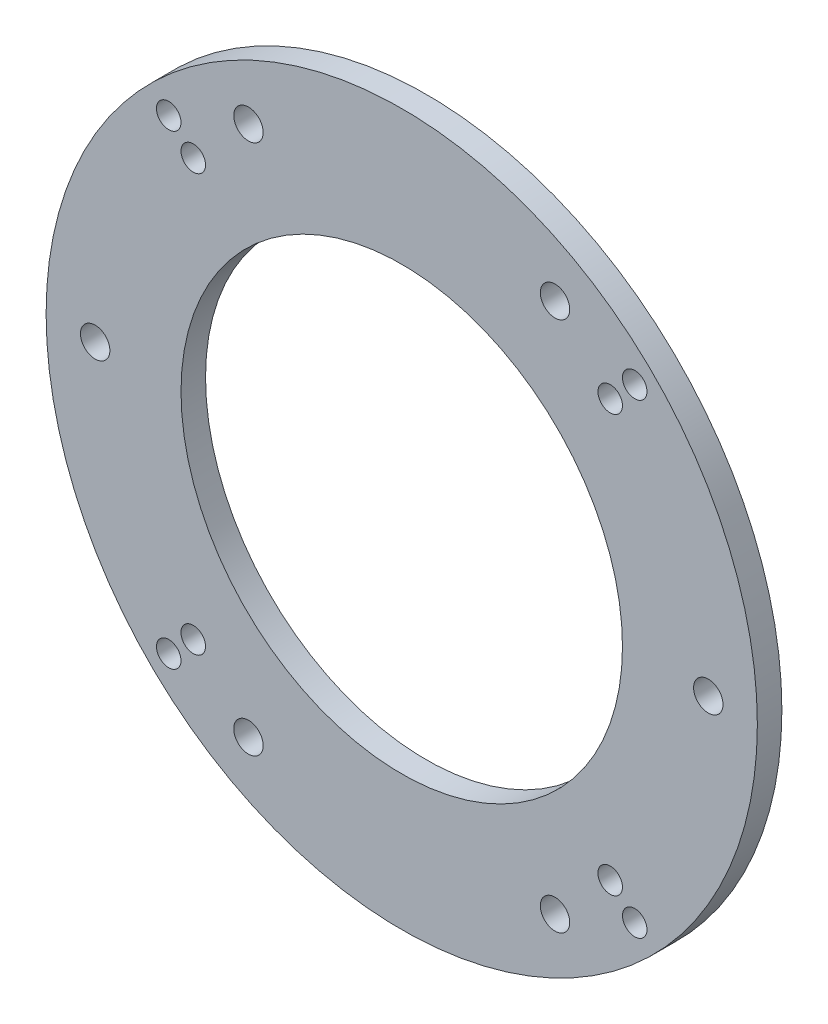
ISO-10303-21;
HEADER;
FILE_DESCRIPTION(('STEP AP214'),'2;1');
FILE_NAME('part.step','',(''),(''),'','','');
FILE_SCHEMA(('AUTOMOTIVE_DESIGN { 1 0 10303 214 1 1 1 1 }'));
ENDSEC;
DATA;
#1=APPLICATION_CONTEXT('core data for automotive mechanical design processes');
#2=APPLICATION_PROTOCOL_DEFINITION('international standard','automotive_design',2000,#1);
#3=PRODUCT_CONTEXT('',#1,'mechanical');
#4=PRODUCT('Part','Part','',(#3));
#5=PRODUCT_RELATED_PRODUCT_CATEGORY('part','',(#4));
#6=PRODUCT_DEFINITION_FORMATION('','',#4);
#7=PRODUCT_DEFINITION_CONTEXT('part definition',#1,'design');
#8=PRODUCT_DEFINITION('design','',#6,#7);
#9=PRODUCT_DEFINITION_SHAPE('','',#8);
#10=(LENGTH_UNIT() NAMED_UNIT(*) SI_UNIT(.MILLI.,.METRE.));
#11=(NAMED_UNIT(*) PLANE_ANGLE_UNIT() SI_UNIT($,.RADIAN.));
#12=(NAMED_UNIT(*) SI_UNIT($,.STERADIAN.) SOLID_ANGLE_UNIT());
#13=UNCERTAINTY_MEASURE_WITH_UNIT(LENGTH_MEASURE(1.E-05),#10,'distance_accuracy_value','');
#14=(GEOMETRIC_REPRESENTATION_CONTEXT(3) GLOBAL_UNCERTAINTY_ASSIGNED_CONTEXT((#13)) GLOBAL_UNIT_ASSIGNED_CONTEXT((#10,
#11,#12)) REPRESENTATION_CONTEXT('',''));
#15=CARTESIAN_POINT('',(0.,0.,0.));
#16=DIRECTION('',(0.,0.,1.));
#17=DIRECTION('',(1.,0.,0.));
#18=AXIS2_PLACEMENT_3D('',#15,#16,#17);
#19=CARTESIAN_POINT('',(0.,0.,2.));
#20=DIRECTION('',(0.,0.,1.));
#21=DIRECTION('',(1.,0.,0.));
#22=AXIS2_PLACEMENT_3D('',#19,#20,#21);
#23=PLANE('',#22);
#24=CARTESIAN_POINT('',(12.5,21.650635094611,2.));
#25=DIRECTION('',(0.,0.,1.));
#26=DIRECTION('',(1.,0.,0.));
#27=AXIS2_PLACEMENT_3D('',#24,#25,#26);
#28=CIRCLE('',#27,1.2);
#29=CARTESIAN_POINT('',(13.7,21.650635094611,2.));
#30=VERTEX_POINT('',#29);
#31=EDGE_CURVE('E119',#30,#30,#28,.T.);
#32=ORIENTED_EDGE('',*,*,#31,.F.);
#33=EDGE_LOOP('',(#32));
#34=FACE_BOUND('',#33,.T.);
#35=CARTESIAN_POINT('',(-12.5,-21.650635094611,2.));
#36=DIRECTION('',(0.,0.,1.));
#37=DIRECTION('',(1.,0.,0.));
#38=AXIS2_PLACEMENT_3D('',#35,#36,#37);
#39=CIRCLE('',#38,1.2);
#40=CARTESIAN_POINT('',(-11.3,-21.650635094611,2.));
#41=VERTEX_POINT('',#40);
#42=EDGE_CURVE('E108',#41,#41,#39,.T.);
#43=ORIENTED_EDGE('',*,*,#42,.F.);
#44=EDGE_LOOP('',(#43));
#45=FACE_BOUND('',#44,.T.);
#46=CARTESIAN_POINT('',(25.,0.,2.));
#47=DIRECTION('',(0.,0.,1.));
#48=DIRECTION('',(1.,0.,0.));
#49=AXIS2_PLACEMENT_3D('',#46,#47,#48);
#50=CIRCLE('',#49,1.2);
#51=CARTESIAN_POINT('',(26.2,0.,2.));
#52=VERTEX_POINT('',#51);
#53=EDGE_CURVE('E107',#52,#52,#50,.T.);
#54=ORIENTED_EDGE('',*,*,#53,.F.);
#55=EDGE_LOOP('',(#54));
#56=FACE_BOUND('',#55,.T.);
#57=CARTESIAN_POINT('',(-25.,0.,2.));
#58=DIRECTION('',(0.,0.,1.));
#59=DIRECTION('',(1.,0.,0.));
#60=AXIS2_PLACEMENT_3D('',#57,#58,#59);
#61=CIRCLE('',#60,1.2);
#62=CARTESIAN_POINT('',(-23.8,0.,2.));
#63=VERTEX_POINT('',#62);
#64=EDGE_CURVE('E101',#63,#63,#61,.T.);
#65=ORIENTED_EDGE('',*,*,#64,.F.);
#66=EDGE_LOOP('',(#65));
#67=FACE_BOUND('',#66,.T.);
#68=CARTESIAN_POINT('',(12.5,-21.650635094611,2.));
#69=DIRECTION('',(0.,0.,1.));
#70=DIRECTION('',(1.,0.,0.));
#71=AXIS2_PLACEMENT_3D('',#68,#69,#70);
#72=CIRCLE('',#71,1.2);
#73=CARTESIAN_POINT('',(13.7,-21.650635094611,2.));
#74=VERTEX_POINT('',#73);
#75=EDGE_CURVE('E120',#74,#74,#72,.T.);
#76=ORIENTED_EDGE('',*,*,#75,.F.);
#77=EDGE_LOOP('',(#76));
#78=FACE_BOUND('',#77,.T.);
#79=CARTESIAN_POINT('',(-12.5,21.650635094611,2.));
#80=DIRECTION('',(0.,0.,1.));
#81=DIRECTION('',(1.,0.,0.));
#82=AXIS2_PLACEMENT_3D('',#79,#80,#81);
#83=CIRCLE('',#82,1.2);
#84=CARTESIAN_POINT('',(-11.3,21.650635094611,2.));
#85=VERTEX_POINT('',#84);
#86=EDGE_CURVE('E97',#85,#85,#83,.T.);
#87=ORIENTED_EDGE('',*,*,#86,.F.);
#88=EDGE_LOOP('',(#87));
#89=FACE_BOUND('',#88,.T.);
#90=CARTESIAN_POINT('',(-19.,19.,2.));
#91=DIRECTION('',(0.,0.,1.));
#92=DIRECTION('',(1.,0.,0.));
#93=AXIS2_PLACEMENT_3D('',#90,#91,#92);
#94=CIRCLE('',#93,0.999999999999987);
#95=CARTESIAN_POINT('',(-18.,19.,2.));
#96=VERTEX_POINT('',#95);
#97=EDGE_CURVE('E94',#96,#96,#94,.T.);
#98=ORIENTED_EDGE('',*,*,#97,.F.);
#99=EDGE_LOOP('',(#98));
#100=FACE_BOUND('',#99,.T.);
#101=CARTESIAN_POINT('',(-17.,17.,2.));
#102=DIRECTION('',(0.,0.,1.));
#103=DIRECTION('',(1.,0.,0.));
#104=AXIS2_PLACEMENT_3D('',#101,#102,#103);
#105=CIRCLE('',#104,0.999999999999987);
#106=CARTESIAN_POINT('',(-16.,17.,2.));
#107=VERTEX_POINT('',#106);
#108=EDGE_CURVE('E88',#107,#107,#105,.T.);
#109=ORIENTED_EDGE('',*,*,#108,.F.);
#110=EDGE_LOOP('',(#109));
#111=FACE_BOUND('',#110,.T.);
#112=CARTESIAN_POINT('',(17.,17.,2.));
#113=DIRECTION('',(0.,0.,1.));
#114=DIRECTION('',(1.,0.,0.));
#115=AXIS2_PLACEMENT_3D('',#112,#113,#114);
#116=CIRCLE('',#115,0.999999999999987);
#117=CARTESIAN_POINT('',(18.,17.,2.));
#118=VERTEX_POINT('',#117);
#119=EDGE_CURVE('E82',#118,#118,#116,.T.);
#120=ORIENTED_EDGE('',*,*,#119,.F.);
#121=EDGE_LOOP('',(#120));
#122=FACE_BOUND('',#121,.T.);
#123=CARTESIAN_POINT('',(19.,19.,2.));
#124=DIRECTION('',(0.,0.,1.));
#125=DIRECTION('',(1.,0.,0.));
#126=AXIS2_PLACEMENT_3D('',#123,#124,#125);
#127=CIRCLE('',#126,0.999999999999987);
#128=CARTESIAN_POINT('',(20.,19.,2.));
#129=VERTEX_POINT('',#128);
#130=EDGE_CURVE('E76',#129,#129,#127,.T.);
#131=ORIENTED_EDGE('',*,*,#130,.F.);
#132=EDGE_LOOP('',(#131));
#133=FACE_BOUND('',#132,.T.);
#134=CARTESIAN_POINT('',(17.,-17.,2.));
#135=DIRECTION('',(0.,0.,1.));
#136=DIRECTION('',(1.,0.,0.));
#137=AXIS2_PLACEMENT_3D('',#134,#135,#136);
#138=CIRCLE('',#137,0.999999999999987);
#139=CARTESIAN_POINT('',(18.,-17.,2.));
#140=VERTEX_POINT('',#139);
#141=EDGE_CURVE('E70',#140,#140,#138,.T.);
#142=ORIENTED_EDGE('',*,*,#141,.F.);
#143=EDGE_LOOP('',(#142));
#144=FACE_BOUND('',#143,.T.);
#145=CARTESIAN_POINT('',(19.,-19.,2.));
#146=DIRECTION('',(0.,0.,1.));
#147=DIRECTION('',(1.,0.,0.));
#148=AXIS2_PLACEMENT_3D('',#145,#146,#147);
#149=CIRCLE('',#148,0.999999999999987);
#150=CARTESIAN_POINT('',(20.,-19.,2.));
#151=VERTEX_POINT('',#150);
#152=EDGE_CURVE('E64',#151,#151,#149,.T.);
#153=ORIENTED_EDGE('',*,*,#152,.F.);
#154=EDGE_LOOP('',(#153));
#155=FACE_BOUND('',#154,.T.);
#156=CARTESIAN_POINT('',(-19.,-19.,2.));
#157=DIRECTION('',(0.,0.,1.));
#158=DIRECTION('',(1.,0.,0.));
#159=AXIS2_PLACEMENT_3D('',#156,#157,#158);
#160=CIRCLE('',#159,0.999999999999987);
#161=CARTESIAN_POINT('',(-18.,-19.,2.));
#162=VERTEX_POINT('',#161);
#163=EDGE_CURVE('E58',#162,#162,#160,.T.);
#164=ORIENTED_EDGE('',*,*,#163,.F.);
#165=EDGE_LOOP('',(#164));
#166=FACE_BOUND('',#165,.T.);
#167=CARTESIAN_POINT('',(-17.,-17.,2.));
#168=DIRECTION('',(0.,0.,1.));
#169=DIRECTION('',(1.,0.,0.));
#170=AXIS2_PLACEMENT_3D('',#167,#168,#169);
#171=CIRCLE('',#170,0.999999999999987);
#172=CARTESIAN_POINT('',(-16.,-17.,2.));
#173=VERTEX_POINT('',#172);
#174=EDGE_CURVE('E52',#173,#173,#171,.T.);
#175=ORIENTED_EDGE('',*,*,#174,.F.);
#176=EDGE_LOOP('',(#175));
#177=FACE_BOUND('',#176,.T.);
#178=CARTESIAN_POINT('',(0.,0.,2.));
#179=DIRECTION('',(0.,0.,1.));
#180=DIRECTION('',(1.,0.,0.));
#181=AXIS2_PLACEMENT_3D('',#178,#179,#180);
#182=CIRCLE('',#181,29.);
#183=CARTESIAN_POINT('',(29.,0.,2.));
#184=VERTEX_POINT('',#183);
#185=EDGE_CURVE('E10',#184,#184,#182,.T.);
#186=ORIENTED_EDGE('',*,*,#185,.T.);
#187=EDGE_LOOP('',(#186));
#188=FACE_BOUND('',#187,.T.);
#189=CARTESIAN_POINT('',(0.,0.,2.));
#190=DIRECTION('',(0.,0.,1.));
#191=DIRECTION('',(1.,0.,0.));
#192=AXIS2_PLACEMENT_3D('',#189,#190,#191);
#193=CIRCLE('',#192,18.);
#194=CARTESIAN_POINT('',(18.,0.,2.));
#195=VERTEX_POINT('',#194);
#196=EDGE_CURVE('E42',#195,#195,#193,.T.);
#197=ORIENTED_EDGE('',*,*,#196,.F.);
#198=EDGE_LOOP('',(#197));
#199=FACE_BOUND('',#198,.T.);
#200=ADVANCED_FACE('F31',(#34,#45,#56,#67,#78,#89,#100,#111,#122,#133,#144,#155,#166,#177,#188,
#199),#23,.T.);
#201=CARTESIAN_POINT('',(0.,0.,0.));
#202=DIRECTION('',(0.,0.,1.));
#203=DIRECTION('',(1.,0.,0.));
#204=AXIS2_PLACEMENT_3D('',#201,#202,#203);
#205=PLANE('',#204);
#206=CARTESIAN_POINT('',(12.5,21.650635094611,0.));
#207=DIRECTION('',(0.,0.,1.));
#208=DIRECTION('',(1.,0.,0.));
#209=AXIS2_PLACEMENT_3D('',#206,#207,#208);
#210=CIRCLE('',#209,1.2);
#211=CARTESIAN_POINT('',(13.7,21.650635094611,0.));
#212=VERTEX_POINT('',#211);
#213=EDGE_CURVE('E116',#212,#212,#210,.T.);
#214=ORIENTED_EDGE('',*,*,#213,.T.);
#215=EDGE_LOOP('',(#214));
#216=FACE_BOUND('',#215,.T.);
#217=CARTESIAN_POINT('',(-12.5,-21.650635094611,0.));
#218=DIRECTION('',(0.,0.,1.));
#219=DIRECTION('',(1.,0.,0.));
#220=AXIS2_PLACEMENT_3D('',#217,#218,#219);
#221=CIRCLE('',#220,1.2);
#222=CARTESIAN_POINT('',(-11.3,-21.650635094611,0.));
#223=VERTEX_POINT('',#222);
#224=EDGE_CURVE('E123',#223,#223,#221,.T.);
#225=ORIENTED_EDGE('',*,*,#224,.T.);
#226=EDGE_LOOP('',(#225));
#227=FACE_BOUND('',#226,.T.);
#228=CARTESIAN_POINT('',(25.,0.,0.));
#229=DIRECTION('',(0.,0.,1.));
#230=DIRECTION('',(1.,0.,0.));
#231=AXIS2_PLACEMENT_3D('',#228,#229,#230);
#232=CIRCLE('',#231,1.2);
#233=CARTESIAN_POINT('',(26.2,0.,0.));
#234=VERTEX_POINT('',#233);
#235=EDGE_CURVE('E104',#234,#234,#232,.T.);
#236=ORIENTED_EDGE('',*,*,#235,.T.);
#237=EDGE_LOOP('',(#236));
#238=FACE_BOUND('',#237,.T.);
#239=CARTESIAN_POINT('',(-25.,0.,0.));
#240=DIRECTION('',(0.,0.,1.));
#241=DIRECTION('',(1.,0.,0.));
#242=AXIS2_PLACEMENT_3D('',#239,#240,#241);
#243=CIRCLE('',#242,1.2);
#244=CARTESIAN_POINT('',(-23.8,0.,0.));
#245=VERTEX_POINT('',#244);
#246=EDGE_CURVE('E111',#245,#245,#243,.T.);
#247=ORIENTED_EDGE('',*,*,#246,.T.);
#248=EDGE_LOOP('',(#247));
#249=FACE_BOUND('',#248,.T.);
#250=CARTESIAN_POINT('',(12.5,-21.650635094611,0.));
#251=DIRECTION('',(0.,0.,1.));
#252=DIRECTION('',(1.,0.,0.));
#253=AXIS2_PLACEMENT_3D('',#250,#251,#252);
#254=CIRCLE('',#253,1.2);
#255=CARTESIAN_POINT('',(13.7,-21.650635094611,0.));
#256=VERTEX_POINT('',#255);
#257=EDGE_CURVE('E128',#256,#256,#254,.T.);
#258=ORIENTED_EDGE('',*,*,#257,.T.);
#259=EDGE_LOOP('',(#258));
#260=FACE_BOUND('',#259,.T.);
#261=CARTESIAN_POINT('',(-12.5,21.650635094611,0.));
#262=DIRECTION('',(0.,0.,1.));
#263=DIRECTION('',(1.,0.,0.));
#264=AXIS2_PLACEMENT_3D('',#261,#262,#263);
#265=CIRCLE('',#264,1.2);
#266=CARTESIAN_POINT('',(-11.3,21.650635094611,0.));
#267=VERTEX_POINT('',#266);
#268=EDGE_CURVE('E98',#267,#267,#265,.T.);
#269=ORIENTED_EDGE('',*,*,#268,.T.);
#270=EDGE_LOOP('',(#269));
#271=FACE_BOUND('',#270,.T.);
#272=CARTESIAN_POINT('',(-19.,19.,0.));
#273=DIRECTION('',(0.,0.,1.));
#274=DIRECTION('',(1.,0.,0.));
#275=AXIS2_PLACEMENT_3D('',#272,#273,#274);
#276=CIRCLE('',#275,1.);
#277=CARTESIAN_POINT('',(-18.,19.,0.));
#278=VERTEX_POINT('',#277);
#279=EDGE_CURVE('E91',#278,#278,#276,.T.);
#280=ORIENTED_EDGE('',*,*,#279,.T.);
#281=EDGE_LOOP('',(#280));
#282=FACE_BOUND('',#281,.T.);
#283=CARTESIAN_POINT('',(-17.,17.,0.));
#284=DIRECTION('',(0.,0.,1.));
#285=DIRECTION('',(1.,0.,0.));
#286=AXIS2_PLACEMENT_3D('',#283,#284,#285);
#287=CIRCLE('',#286,1.);
#288=CARTESIAN_POINT('',(-16.,17.,0.));
#289=VERTEX_POINT('',#288);
#290=EDGE_CURVE('E85',#289,#289,#287,.T.);
#291=ORIENTED_EDGE('',*,*,#290,.T.);
#292=EDGE_LOOP('',(#291));
#293=FACE_BOUND('',#292,.T.);
#294=CARTESIAN_POINT('',(17.,17.,0.));
#295=DIRECTION('',(0.,0.,1.));
#296=DIRECTION('',(1.,0.,0.));
#297=AXIS2_PLACEMENT_3D('',#294,#295,#296);
#298=CIRCLE('',#297,1.);
#299=CARTESIAN_POINT('',(18.,17.,0.));
#300=VERTEX_POINT('',#299);
#301=EDGE_CURVE('E79',#300,#300,#298,.T.);
#302=ORIENTED_EDGE('',*,*,#301,.T.);
#303=EDGE_LOOP('',(#302));
#304=FACE_BOUND('',#303,.T.);
#305=CARTESIAN_POINT('',(19.,19.,0.));
#306=DIRECTION('',(0.,0.,1.));
#307=DIRECTION('',(1.,0.,0.));
#308=AXIS2_PLACEMENT_3D('',#305,#306,#307);
#309=CIRCLE('',#308,1.);
#310=CARTESIAN_POINT('',(20.,19.,0.));
#311=VERTEX_POINT('',#310);
#312=EDGE_CURVE('E73',#311,#311,#309,.T.);
#313=ORIENTED_EDGE('',*,*,#312,.T.);
#314=EDGE_LOOP('',(#313));
#315=FACE_BOUND('',#314,.T.);
#316=CARTESIAN_POINT('',(17.,-17.,0.));
#317=DIRECTION('',(0.,0.,1.));
#318=DIRECTION('',(1.,0.,0.));
#319=AXIS2_PLACEMENT_3D('',#316,#317,#318);
#320=CIRCLE('',#319,1.);
#321=CARTESIAN_POINT('',(18.,-17.,0.));
#322=VERTEX_POINT('',#321);
#323=EDGE_CURVE('E67',#322,#322,#320,.T.);
#324=ORIENTED_EDGE('',*,*,#323,.T.);
#325=EDGE_LOOP('',(#324));
#326=FACE_BOUND('',#325,.T.);
#327=CARTESIAN_POINT('',(19.,-19.,0.));
#328=DIRECTION('',(0.,0.,1.));
#329=DIRECTION('',(1.,0.,0.));
#330=AXIS2_PLACEMENT_3D('',#327,#328,#329);
#331=CIRCLE('',#330,1.);
#332=CARTESIAN_POINT('',(20.,-19.,0.));
#333=VERTEX_POINT('',#332);
#334=EDGE_CURVE('E61',#333,#333,#331,.T.);
#335=ORIENTED_EDGE('',*,*,#334,.T.);
#336=EDGE_LOOP('',(#335));
#337=FACE_BOUND('',#336,.T.);
#338=CARTESIAN_POINT('',(-19.,-19.,0.));
#339=DIRECTION('',(0.,0.,1.));
#340=DIRECTION('',(1.,0.,0.));
#341=AXIS2_PLACEMENT_3D('',#338,#339,#340);
#342=CIRCLE('',#341,1.);
#343=CARTESIAN_POINT('',(-18.,-19.,0.));
#344=VERTEX_POINT('',#343);
#345=EDGE_CURVE('E55',#344,#344,#342,.T.);
#346=ORIENTED_EDGE('',*,*,#345,.T.);
#347=EDGE_LOOP('',(#346));
#348=FACE_BOUND('',#347,.T.);
#349=CARTESIAN_POINT('',(-17.,-17.,0.));
#350=DIRECTION('',(0.,0.,1.));
#351=DIRECTION('',(1.,0.,0.));
#352=AXIS2_PLACEMENT_3D('',#349,#350,#351);
#353=CIRCLE('',#352,1.);
#354=CARTESIAN_POINT('',(-16.,-17.,0.));
#355=VERTEX_POINT('',#354);
#356=EDGE_CURVE('E47',#355,#355,#353,.T.);
#357=ORIENTED_EDGE('',*,*,#356,.T.);
#358=EDGE_LOOP('',(#357));
#359=FACE_BOUND('',#358,.T.);
#360=CARTESIAN_POINT('',(0.,0.,0.));
#361=DIRECTION('',(0.,0.,1.));
#362=DIRECTION('',(1.,0.,0.));
#363=AXIS2_PLACEMENT_3D('',#360,#361,#362);
#364=CIRCLE('',#363,29.);
#365=CARTESIAN_POINT('',(29.,0.,0.));
#366=VERTEX_POINT('',#365);
#367=EDGE_CURVE('E35',#366,#366,#364,.T.);
#368=ORIENTED_EDGE('',*,*,#367,.F.);
#369=EDGE_LOOP('',(#368));
#370=FACE_BOUND('',#369,.T.);
#371=CARTESIAN_POINT('',(0.,0.,0.));
#372=DIRECTION('',(0.,0.,1.));
#373=DIRECTION('',(1.,0.,0.));
#374=AXIS2_PLACEMENT_3D('',#371,#372,#373);
#375=CIRCLE('',#374,18.);
#376=CARTESIAN_POINT('',(18.,0.,0.));
#377=VERTEX_POINT('',#376);
#378=EDGE_CURVE('E44',#377,#377,#375,.T.);
#379=ORIENTED_EDGE('',*,*,#378,.T.);
#380=EDGE_LOOP('',(#379));
#381=FACE_BOUND('',#380,.T.);
#382=ADVANCED_FACE('F139',(#216,#227,#238,#249,#260,#271,#282,#293,#304,#315,#326,#337,#348,
#359,#370,#381),#205,.F.);
#383=CARTESIAN_POINT('',(0.,0.,2.));
#384=DIRECTION('',(0.,0.,-1.));
#385=DIRECTION('',(-1.,0.,0.));
#386=AXIS2_PLACEMENT_3D('',#383,#384,#385);
#387=CYLINDRICAL_SURFACE('',#386,29.);
#388=ORIENTED_EDGE('',*,*,#367,.T.);
#389=EDGE_LOOP('',(#388));
#390=FACE_BOUND('',#389,.T.);
#391=ORIENTED_EDGE('',*,*,#185,.F.);
#392=EDGE_LOOP('',(#391));
#393=FACE_BOUND('',#392,.T.);
#394=ADVANCED_FACE('F33',(#390,#393),#387,.T.);
#395=CARTESIAN_POINT('',(0.,0.,2.));
#396=DIRECTION('',(0.,0.,-1.));
#397=DIRECTION('',(-1.,0.,0.));
#398=AXIS2_PLACEMENT_3D('',#395,#396,#397);
#399=CYLINDRICAL_SURFACE('',#398,18.);
#400=ORIENTED_EDGE('',*,*,#196,.T.);
#401=EDGE_LOOP('',(#400));
#402=FACE_BOUND('',#401,.T.);
#403=ORIENTED_EDGE('',*,*,#378,.F.);
#404=EDGE_LOOP('',(#403));
#405=FACE_BOUND('',#404,.T.);
#406=ADVANCED_FACE('F162',(#402,#405),#399,.F.);
#407=CARTESIAN_POINT('',(-17.,-17.,2.));
#408=DIRECTION('',(0.,0.,1.));
#409=DIRECTION('',(1.,0.,0.));
#410=AXIS2_PLACEMENT_3D('',#407,#408,#409);
#411=CYLINDRICAL_SURFACE('',#410,0.999999999999994);
#412=ORIENTED_EDGE('',*,*,#356,.F.);
#413=EDGE_LOOP('',(#412));
#414=FACE_BOUND('',#413,.T.);
#415=ORIENTED_EDGE('',*,*,#174,.T.);
#416=EDGE_LOOP('',(#415));
#417=FACE_BOUND('',#416,.T.);
#418=ADVANCED_FACE('F165',(#414,#417),#411,.F.);
#419=CARTESIAN_POINT('',(-19.,-19.,2.));
#420=DIRECTION('',(0.,0.,1.));
#421=DIRECTION('',(1.,0.,0.));
#422=AXIS2_PLACEMENT_3D('',#419,#420,#421);
#423=CYLINDRICAL_SURFACE('',#422,0.999999999999994);
#424=ORIENTED_EDGE('',*,*,#345,.F.);
#425=EDGE_LOOP('',(#424));
#426=FACE_BOUND('',#425,.T.);
#427=ORIENTED_EDGE('',*,*,#163,.T.);
#428=EDGE_LOOP('',(#427));
#429=FACE_BOUND('',#428,.T.);
#430=ADVANCED_FACE('F179',(#426,#429),#423,.F.);
#431=CARTESIAN_POINT('',(19.,-19.,2.));
#432=DIRECTION('',(0.,0.,1.));
#433=DIRECTION('',(1.,0.,0.));
#434=AXIS2_PLACEMENT_3D('',#431,#432,#433);
#435=CYLINDRICAL_SURFACE('',#434,0.999999999999994);
#436=ORIENTED_EDGE('',*,*,#334,.F.);
#437=EDGE_LOOP('',(#436));
#438=FACE_BOUND('',#437,.T.);
#439=ORIENTED_EDGE('',*,*,#152,.T.);
#440=EDGE_LOOP('',(#439));
#441=FACE_BOUND('',#440,.T.);
#442=ADVANCED_FACE('F183',(#438,#441),#435,.F.);
#443=CARTESIAN_POINT('',(17.,-17.,2.));
#444=DIRECTION('',(0.,0.,1.));
#445=DIRECTION('',(1.,0.,0.));
#446=AXIS2_PLACEMENT_3D('',#443,#444,#445);
#447=CYLINDRICAL_SURFACE('',#446,0.999999999999994);
#448=ORIENTED_EDGE('',*,*,#323,.F.);
#449=EDGE_LOOP('',(#448));
#450=FACE_BOUND('',#449,.T.);
#451=ORIENTED_EDGE('',*,*,#141,.T.);
#452=EDGE_LOOP('',(#451));
#453=FACE_BOUND('',#452,.T.);
#454=ADVANCED_FACE('F187',(#450,#453),#447,.F.);
#455=CARTESIAN_POINT('',(19.,19.,2.));
#456=DIRECTION('',(0.,0.,1.));
#457=DIRECTION('',(1.,0.,0.));
#458=AXIS2_PLACEMENT_3D('',#455,#456,#457);
#459=CYLINDRICAL_SURFACE('',#458,0.999999999999994);
#460=ORIENTED_EDGE('',*,*,#312,.F.);
#461=EDGE_LOOP('',(#460));
#462=FACE_BOUND('',#461,.T.);
#463=ORIENTED_EDGE('',*,*,#130,.T.);
#464=EDGE_LOOP('',(#463));
#465=FACE_BOUND('',#464,.T.);
#466=ADVANCED_FACE('F191',(#462,#465),#459,.F.);
#467=CARTESIAN_POINT('',(17.,17.,2.));
#468=DIRECTION('',(0.,0.,1.));
#469=DIRECTION('',(1.,0.,0.));
#470=AXIS2_PLACEMENT_3D('',#467,#468,#469);
#471=CYLINDRICAL_SURFACE('',#470,0.999999999999994);
#472=ORIENTED_EDGE('',*,*,#301,.F.);
#473=EDGE_LOOP('',(#472));
#474=FACE_BOUND('',#473,.T.);
#475=ORIENTED_EDGE('',*,*,#119,.T.);
#476=EDGE_LOOP('',(#475));
#477=FACE_BOUND('',#476,.T.);
#478=ADVANCED_FACE('F195',(#474,#477),#471,.F.);
#479=CARTESIAN_POINT('',(-17.,17.,2.));
#480=DIRECTION('',(0.,0.,1.));
#481=DIRECTION('',(1.,0.,0.));
#482=AXIS2_PLACEMENT_3D('',#479,#480,#481);
#483=CYLINDRICAL_SURFACE('',#482,0.999999999999994);
#484=ORIENTED_EDGE('',*,*,#290,.F.);
#485=EDGE_LOOP('',(#484));
#486=FACE_BOUND('',#485,.T.);
#487=ORIENTED_EDGE('',*,*,#108,.T.);
#488=EDGE_LOOP('',(#487));
#489=FACE_BOUND('',#488,.T.);
#490=ADVANCED_FACE('F199',(#486,#489),#483,.F.);
#491=CARTESIAN_POINT('',(-19.,19.,2.));
#492=DIRECTION('',(0.,0.,1.));
#493=DIRECTION('',(1.,0.,0.));
#494=AXIS2_PLACEMENT_3D('',#491,#492,#493);
#495=CYLINDRICAL_SURFACE('',#494,0.999999999999994);
#496=ORIENTED_EDGE('',*,*,#279,.F.);
#497=EDGE_LOOP('',(#496));
#498=FACE_BOUND('',#497,.T.);
#499=ORIENTED_EDGE('',*,*,#97,.T.);
#500=EDGE_LOOP('',(#499));
#501=FACE_BOUND('',#500,.T.);
#502=ADVANCED_FACE('F203',(#498,#501),#495,.F.);
#503=CARTESIAN_POINT('',(-12.5,21.650635094611,2.));
#504=DIRECTION('',(0.,0.,-1.));
#505=DIRECTION('',(-1.,0.,0.));
#506=AXIS2_PLACEMENT_3D('',#503,#504,#505);
#507=CYLINDRICAL_SURFACE('',#506,1.2);
#508=ORIENTED_EDGE('',*,*,#86,.T.);
#509=EDGE_LOOP('',(#508));
#510=FACE_BOUND('',#509,.T.);
#511=ORIENTED_EDGE('',*,*,#268,.F.);
#512=EDGE_LOOP('',(#511));
#513=FACE_BOUND('',#512,.T.);
#514=ADVANCED_FACE('F207',(#510,#513),#507,.F.);
#515=CARTESIAN_POINT('',(12.5,-21.650635094611,2.));
#516=DIRECTION('',(0.,0.,-1.));
#517=DIRECTION('',(-1.,0.,0.));
#518=AXIS2_PLACEMENT_3D('',#515,#516,#517);
#519=CYLINDRICAL_SURFACE('',#518,1.2);
#520=ORIENTED_EDGE('',*,*,#75,.T.);
#521=EDGE_LOOP('',(#520));
#522=FACE_BOUND('',#521,.T.);
#523=ORIENTED_EDGE('',*,*,#257,.F.);
#524=EDGE_LOOP('',(#523));
#525=FACE_BOUND('',#524,.T.);
#526=ADVANCED_FACE('F134',(#522,#525),#519,.F.);
#527=CARTESIAN_POINT('',(-25.,0.,2.));
#528=DIRECTION('',(0.,0.,-1.));
#529=DIRECTION('',(-1.,0.,0.));
#530=AXIS2_PLACEMENT_3D('',#527,#528,#529);
#531=CYLINDRICAL_SURFACE('',#530,1.2);
#532=ORIENTED_EDGE('',*,*,#64,.T.);
#533=EDGE_LOOP('',(#532));
#534=FACE_BOUND('',#533,.T.);
#535=ORIENTED_EDGE('',*,*,#246,.F.);
#536=EDGE_LOOP('',(#535));
#537=FACE_BOUND('',#536,.T.);
#538=ADVANCED_FACE('F216',(#534,#537),#531,.F.);
#539=CARTESIAN_POINT('',(25.,0.,2.));
#540=DIRECTION('',(0.,0.,-1.));
#541=DIRECTION('',(-1.,0.,0.));
#542=AXIS2_PLACEMENT_3D('',#539,#540,#541);
#543=CYLINDRICAL_SURFACE('',#542,1.2);
#544=ORIENTED_EDGE('',*,*,#53,.T.);
#545=EDGE_LOOP('',(#544));
#546=FACE_BOUND('',#545,.T.);
#547=ORIENTED_EDGE('',*,*,#235,.F.);
#548=EDGE_LOOP('',(#547));
#549=FACE_BOUND('',#548,.T.);
#550=ADVANCED_FACE('F212',(#546,#549),#543,.F.);
#551=CARTESIAN_POINT('',(-12.5,-21.650635094611,2.));
#552=DIRECTION('',(0.,0.,-1.));
#553=DIRECTION('',(-1.,0.,0.));
#554=AXIS2_PLACEMENT_3D('',#551,#552,#553);
#555=CYLINDRICAL_SURFACE('',#554,1.2);
#556=ORIENTED_EDGE('',*,*,#42,.T.);
#557=EDGE_LOOP('',(#556));
#558=FACE_BOUND('',#557,.T.);
#559=ORIENTED_EDGE('',*,*,#224,.F.);
#560=EDGE_LOOP('',(#559));
#561=FACE_BOUND('',#560,.T.);
#562=ADVANCED_FACE('F215',(#558,#561),#555,.F.);
#563=CARTESIAN_POINT('',(12.5,21.650635094611,2.));
#564=DIRECTION('',(0.,0.,-1.));
#565=DIRECTION('',(-1.,0.,0.));
#566=AXIS2_PLACEMENT_3D('',#563,#564,#565);
#567=CYLINDRICAL_SURFACE('',#566,1.2);
#568=ORIENTED_EDGE('',*,*,#31,.T.);
#569=EDGE_LOOP('',(#568));
#570=FACE_BOUND('',#569,.T.);
#571=ORIENTED_EDGE('',*,*,#213,.F.);
#572=EDGE_LOOP('',(#571));
#573=FACE_BOUND('',#572,.T.);
#574=ADVANCED_FACE('F221',(#570,#573),#567,.F.);
#575=CLOSED_SHELL('',(#200,#382,#394,#406,#418,#430,#442,#454,#466,#478,#490,#502,#514,#526,
#538,#550,#562,#574));
#576=MANIFOLD_SOLID_BREP('B2',#575);
#577=ADVANCED_BREP_SHAPE_REPRESENTATION('',(#18,#576),#14);
#578=SHAPE_DEFINITION_REPRESENTATION(#9,#577);
ENDSEC;
END-ISO-10303-21;
